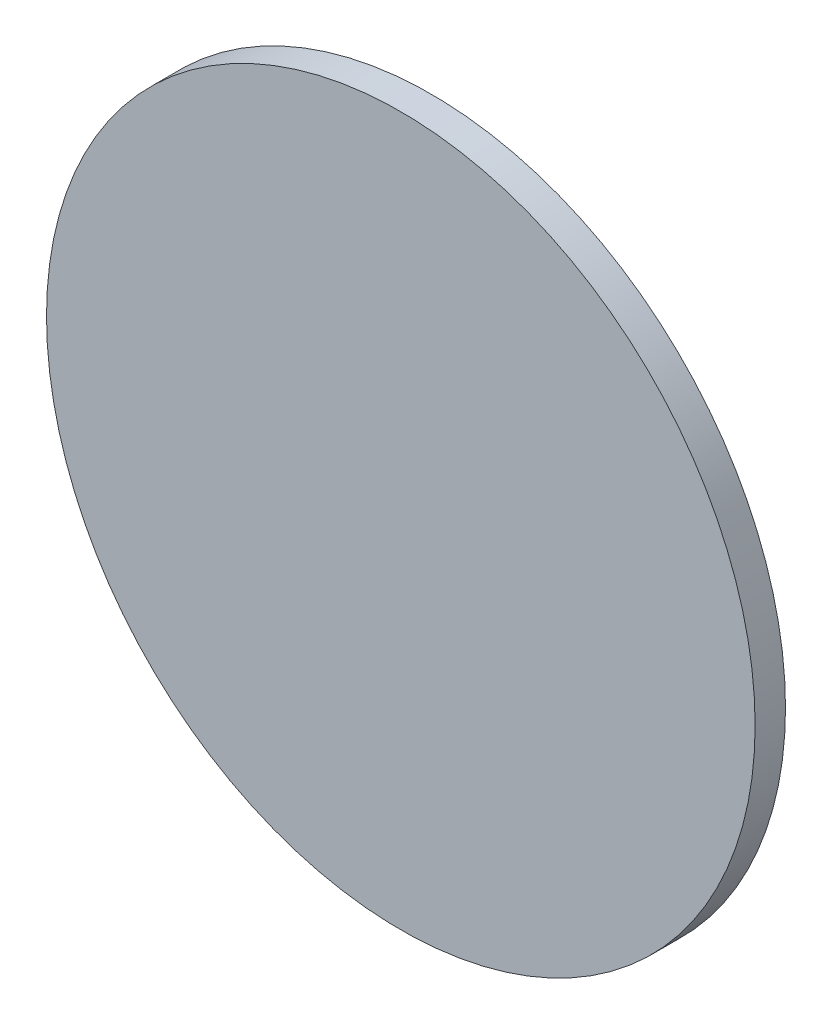
ISO-10303-21;
HEADER;
FILE_DESCRIPTION(('STEP AP214'),'2;1');
FILE_NAME('part.step','',(''),(''),'','','');
FILE_SCHEMA(('AUTOMOTIVE_DESIGN { 1 0 10303 214 1 1 1 1 }'));
ENDSEC;
DATA;
#1=APPLICATION_CONTEXT('core data for automotive mechanical design processes');
#2=APPLICATION_PROTOCOL_DEFINITION('international standard','automotive_design',2000,#1);
#3=PRODUCT_CONTEXT('',#1,'mechanical');
#4=PRODUCT('Part','Part','',(#3));
#5=PRODUCT_RELATED_PRODUCT_CATEGORY('part','',(#4));
#6=PRODUCT_DEFINITION_FORMATION('','',#4);
#7=PRODUCT_DEFINITION_CONTEXT('part definition',#1,'design');
#8=PRODUCT_DEFINITION('design','',#6,#7);
#9=PRODUCT_DEFINITION_SHAPE('','',#8);
#10=(LENGTH_UNIT() NAMED_UNIT(*) SI_UNIT(.MILLI.,.METRE.));
#11=(NAMED_UNIT(*) PLANE_ANGLE_UNIT() SI_UNIT($,.RADIAN.));
#12=(NAMED_UNIT(*) SI_UNIT($,.STERADIAN.) SOLID_ANGLE_UNIT());
#13=UNCERTAINTY_MEASURE_WITH_UNIT(LENGTH_MEASURE(1.E-05),#10,'distance_accuracy_value','');
#14=(GEOMETRIC_REPRESENTATION_CONTEXT(3) GLOBAL_UNCERTAINTY_ASSIGNED_CONTEXT((#13)) GLOBAL_UNIT_ASSIGNED_CONTEXT((#10,
#11,#12)) REPRESENTATION_CONTEXT('',''));
#15=CARTESIAN_POINT('',(0.,0.,0.));
#16=DIRECTION('',(0.,0.,1.));
#17=DIRECTION('',(1.,0.,0.));
#18=AXIS2_PLACEMENT_3D('',#15,#16,#17);
#19=CARTESIAN_POINT('',(0.,0.,1.5));
#20=DIRECTION('',(0.,0.,-1.));
#21=DIRECTION('',(-1.,0.,0.));
#22=AXIS2_PLACEMENT_3D('',#19,#20,#21);
#23=CYLINDRICAL_SURFACE('',#22,17.5);
#24=CARTESIAN_POINT('',(0.,0.,1.5));
#25=DIRECTION('',(0.,0.,1.));
#26=DIRECTION('',(1.,0.,0.));
#27=AXIS2_PLACEMENT_3D('',#24,#25,#26);
#28=CIRCLE('',#27,17.5);
#29=CARTESIAN_POINT('',(17.5,0.,1.5));
#30=VERTEX_POINT('',#29);
#31=EDGE_CURVE('E10',#30,#30,#28,.T.);
#32=ORIENTED_EDGE('',*,*,#31,.F.);
#33=EDGE_LOOP('',(#32));
#34=FACE_BOUND('',#33,.T.);
#35=CARTESIAN_POINT('',(0.,0.,0.));
#36=DIRECTION('',(0.,0.,1.));
#37=DIRECTION('',(1.,0.,0.));
#38=AXIS2_PLACEMENT_3D('',#35,#36,#37);
#39=CIRCLE('',#38,17.5);
#40=CARTESIAN_POINT('',(17.5,0.,0.));
#41=VERTEX_POINT('',#40);
#42=EDGE_CURVE('E36',#41,#41,#39,.T.);
#43=ORIENTED_EDGE('',*,*,#42,.T.);
#44=EDGE_LOOP('',(#43));
#45=FACE_BOUND('',#44,.T.);
#46=ADVANCED_FACE('F33',(#34,#45),#23,.T.);
#47=CARTESIAN_POINT('',(0.,0.,1.5));
#48=DIRECTION('',(0.,0.,1.));
#49=DIRECTION('',(1.,0.,0.));
#50=AXIS2_PLACEMENT_3D('',#47,#48,#49);
#51=PLANE('',#50);
#52=ORIENTED_EDGE('',*,*,#31,.T.);
#53=EDGE_LOOP('',(#52));
#54=FACE_BOUND('',#53,.T.);
#55=ADVANCED_FACE('F48',(#54),#51,.T.);
#56=CARTESIAN_POINT('',(0.,0.,0.));
#57=DIRECTION('',(0.,0.,1.));
#58=DIRECTION('',(1.,0.,0.));
#59=AXIS2_PLACEMENT_3D('',#56,#57,#58);
#60=PLANE('',#59);
#61=ORIENTED_EDGE('',*,*,#42,.F.);
#62=EDGE_LOOP('',(#61));
#63=FACE_BOUND('',#62,.T.);
#64=ADVANCED_FACE('F46',(#63),#60,.F.);
#65=CLOSED_SHELL('',(#46,#55,#64));
#66=MANIFOLD_SOLID_BREP('B2',#65);
#67=ADVANCED_BREP_SHAPE_REPRESENTATION('',(#18,#66),#14);
#68=SHAPE_DEFINITION_REPRESENTATION(#9,#67);
ENDSEC;
END-ISO-10303-21;
